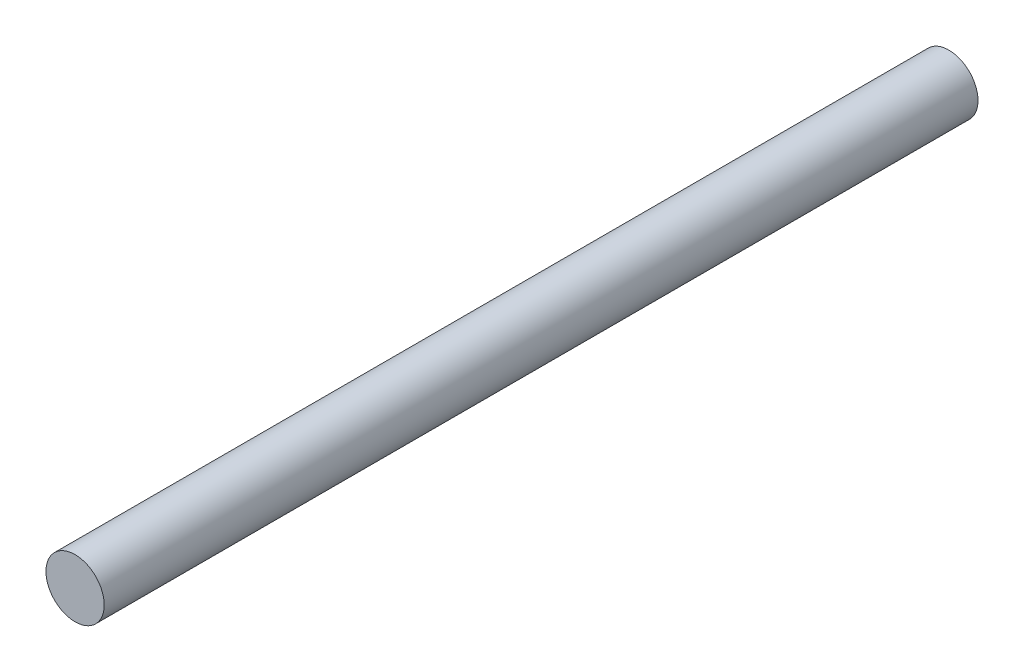
ISO-10303-21;
HEADER;
FILE_DESCRIPTION(('STEP AP214'),'2;1');
FILE_NAME('part.step','',(''),(''),'','','');
FILE_SCHEMA(('AUTOMOTIVE_DESIGN { 1 0 10303 214 1 1 1 1 }'));
ENDSEC;
DATA;
#1=APPLICATION_CONTEXT('core data for automotive mechanical design processes');
#2=APPLICATION_PROTOCOL_DEFINITION('international standard','automotive_design',2000,#1);
#3=PRODUCT_CONTEXT('',#1,'mechanical');
#4=PRODUCT('Part','Part','',(#3));
#5=PRODUCT_RELATED_PRODUCT_CATEGORY('part','',(#4));
#6=PRODUCT_DEFINITION_FORMATION('','',#4);
#7=PRODUCT_DEFINITION_CONTEXT('part definition',#1,'design');
#8=PRODUCT_DEFINITION('design','',#6,#7);
#9=PRODUCT_DEFINITION_SHAPE('','',#8);
#10=(LENGTH_UNIT() NAMED_UNIT(*) SI_UNIT(.MILLI.,.METRE.));
#11=(NAMED_UNIT(*) PLANE_ANGLE_UNIT() SI_UNIT($,.RADIAN.));
#12=(NAMED_UNIT(*) SI_UNIT($,.STERADIAN.) SOLID_ANGLE_UNIT());
#13=UNCERTAINTY_MEASURE_WITH_UNIT(LENGTH_MEASURE(1.E-05),#10,'distance_accuracy_value','');
#14=(GEOMETRIC_REPRESENTATION_CONTEXT(3) GLOBAL_UNCERTAINTY_ASSIGNED_CONTEXT((#13)) GLOBAL_UNIT_ASSIGNED_CONTEXT((#10,
#11,#12)) REPRESENTATION_CONTEXT('',''));
#15=CARTESIAN_POINT('',(0.,0.,0.));
#16=DIRECTION('',(0.,0.,1.));
#17=DIRECTION('',(1.,0.,0.));
#18=AXIS2_PLACEMENT_3D('',#15,#16,#17);
#19=CARTESIAN_POINT('',(0.,0.,89.9999999999998));
#20=DIRECTION('',(0.,0.,-1.));
#21=DIRECTION('',(-1.,0.,0.));
#22=AXIS2_PLACEMENT_3D('',#19,#20,#21);
#23=CYLINDRICAL_SURFACE('',#22,3.);
#24=CARTESIAN_POINT('',(0.,0.,89.9999999999998));
#25=DIRECTION('',(0.,0.,1.));
#26=DIRECTION('',(1.,0.,0.));
#27=AXIS2_PLACEMENT_3D('',#24,#25,#26);
#28=CIRCLE('',#27,3.);
#29=CARTESIAN_POINT('',(3.,0.,89.9999999999998));
#30=VERTEX_POINT('',#29);
#31=EDGE_CURVE('E10',#30,#30,#28,.T.);
#32=ORIENTED_EDGE('',*,*,#31,.F.);
#33=EDGE_LOOP('',(#32));
#34=FACE_BOUND('',#33,.T.);
#35=CARTESIAN_POINT('',(0.,0.,0.));
#36=DIRECTION('',(0.,0.,1.));
#37=DIRECTION('',(1.,0.,0.));
#38=AXIS2_PLACEMENT_3D('',#35,#36,#37);
#39=CIRCLE('',#38,3.);
#40=CARTESIAN_POINT('',(3.,0.,0.));
#41=VERTEX_POINT('',#40);
#42=EDGE_CURVE('E35',#41,#41,#39,.T.);
#43=ORIENTED_EDGE('',*,*,#42,.T.);
#44=EDGE_LOOP('',(#43));
#45=FACE_BOUND('',#44,.T.);
#46=ADVANCED_FACE('F32',(#34,#45),#23,.T.);
#47=CARTESIAN_POINT('',(0.,0.,89.9999999999998));
#48=DIRECTION('',(0.,0.,1.));
#49=DIRECTION('',(1.,0.,0.));
#50=AXIS2_PLACEMENT_3D('',#47,#48,#49);
#51=PLANE('',#50);
#52=ORIENTED_EDGE('',*,*,#31,.T.);
#53=EDGE_LOOP('',(#52));
#54=FACE_BOUND('',#53,.T.);
#55=ADVANCED_FACE('F47',(#54),#51,.T.);
#56=CARTESIAN_POINT('',(0.,0.,0.));
#57=DIRECTION('',(0.,0.,1.));
#58=DIRECTION('',(1.,0.,0.));
#59=AXIS2_PLACEMENT_3D('',#56,#57,#58);
#60=PLANE('',#59);
#61=ORIENTED_EDGE('',*,*,#42,.F.);
#62=EDGE_LOOP('',(#61));
#63=FACE_BOUND('',#62,.T.);
#64=ADVANCED_FACE('F45',(#63),#60,.F.);
#65=CLOSED_SHELL('',(#46,#55,#64));
#66=MANIFOLD_SOLID_BREP('B2',#65);
#67=ADVANCED_BREP_SHAPE_REPRESENTATION('',(#18,#66),#14);
#68=SHAPE_DEFINITION_REPRESENTATION(#9,#67);
ENDSEC;
END-ISO-10303-21;
